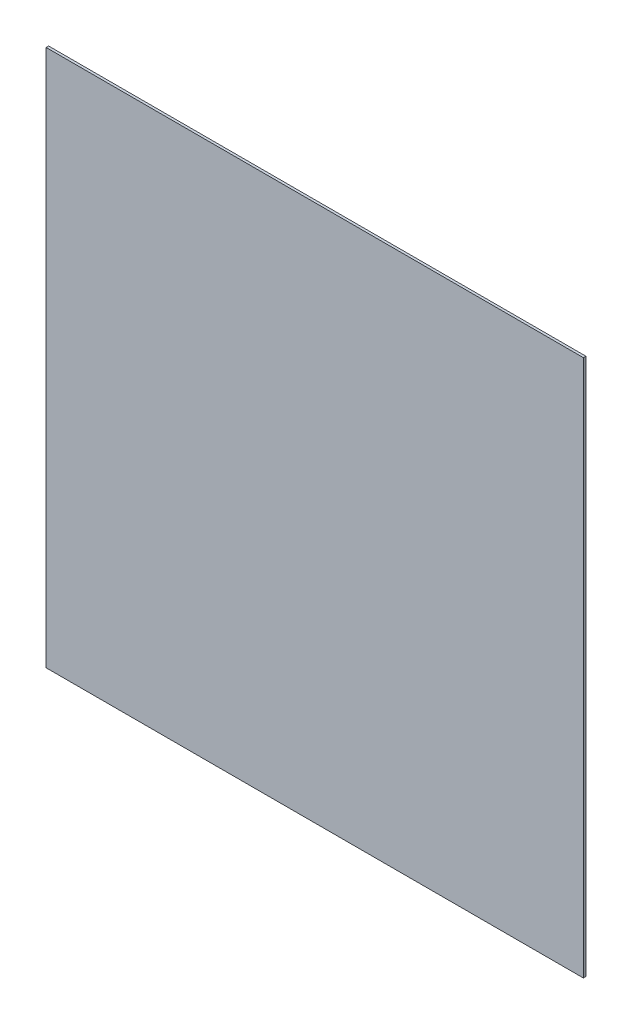
ISO-10303-21;
HEADER;
FILE_DESCRIPTION(('STEP AP214'),'2;1');
FILE_NAME('part.step','',(''),(''),'','','');
FILE_SCHEMA(('AUTOMOTIVE_DESIGN { 1 0 10303 214 1 1 1 1 }'));
ENDSEC;
DATA;
#1=APPLICATION_CONTEXT('core data for automotive mechanical design processes');
#2=APPLICATION_PROTOCOL_DEFINITION('international standard','automotive_design',2000,#1);
#3=PRODUCT_CONTEXT('',#1,'mechanical');
#4=PRODUCT('Part','Part','',(#3));
#5=PRODUCT_RELATED_PRODUCT_CATEGORY('part','',(#4));
#6=PRODUCT_DEFINITION_FORMATION('','',#4);
#7=PRODUCT_DEFINITION_CONTEXT('part definition',#1,'design');
#8=PRODUCT_DEFINITION('design','',#6,#7);
#9=PRODUCT_DEFINITION_SHAPE('','',#8);
#10=(LENGTH_UNIT() NAMED_UNIT(*) SI_UNIT(.MILLI.,.METRE.));
#11=(NAMED_UNIT(*) PLANE_ANGLE_UNIT() SI_UNIT($,.RADIAN.));
#12=(NAMED_UNIT(*) SI_UNIT($,.STERADIAN.) SOLID_ANGLE_UNIT());
#13=UNCERTAINTY_MEASURE_WITH_UNIT(LENGTH_MEASURE(1.E-05),#10,'distance_accuracy_value','');
#14=(GEOMETRIC_REPRESENTATION_CONTEXT(3) GLOBAL_UNCERTAINTY_ASSIGNED_CONTEXT((#13)) GLOBAL_UNIT_ASSIGNED_CONTEXT((#10,
#11,#12)) REPRESENTATION_CONTEXT('',''));
#15=CARTESIAN_POINT('',(0.,0.,0.));
#16=DIRECTION('',(0.,0.,1.));
#17=DIRECTION('',(1.,0.,0.));
#18=AXIS2_PLACEMENT_3D('',#15,#16,#17);
#19=CARTESIAN_POINT('',(-160.,160.,1.5));
#20=DIRECTION('',(1.,0.,0.));
#21=DIRECTION('',(0.,1.,0.));
#22=AXIS2_PLACEMENT_3D('',#19,#20,#21);
#23=PLANE('',#22);
#24=DIRECTION('',(0.,-1.,0.));
#25=VECTOR('',#24,1.);
#26=CARTESIAN_POINT('',(-160.,160.,0.));
#27=LINE('',#26,#25);
#28=CARTESIAN_POINT('',(-160.,160.,0.));
#29=VERTEX_POINT('',#28);
#30=CARTESIAN_POINT('',(-160.,-160.,0.));
#31=VERTEX_POINT('',#30);
#32=EDGE_CURVE('E96',#29,#31,#27,.T.);
#33=ORIENTED_EDGE('',*,*,#32,.T.);
#34=DIRECTION('',(0.,0.,-1.));
#35=VECTOR('',#34,1.);
#36=CARTESIAN_POINT('',(-160.,-160.,1.5));
#37=LINE('',#36,#35);
#38=CARTESIAN_POINT('',(-160.,-160.,1.5));
#39=VERTEX_POINT('',#38);
#40=EDGE_CURVE('E11',#39,#31,#37,.T.);
#41=ORIENTED_EDGE('',*,*,#40,.F.);
#42=DIRECTION('',(0.,-1.,0.));
#43=VECTOR('',#42,1.);
#44=CARTESIAN_POINT('',(-160.,160.,1.5));
#45=LINE('',#44,#43);
#46=CARTESIAN_POINT('',(-160.,160.,1.5));
#47=VERTEX_POINT('',#46);
#48=EDGE_CURVE('E84',#47,#39,#45,.T.);
#49=ORIENTED_EDGE('',*,*,#48,.F.);
#50=DIRECTION('',(0.,0.,-1.));
#51=VECTOR('',#50,1.);
#52=CARTESIAN_POINT('',(-160.,160.,1.5));
#53=LINE('',#52,#51);
#54=EDGE_CURVE('E92',#47,#29,#53,.T.);
#55=ORIENTED_EDGE('',*,*,#54,.T.);
#56=EDGE_LOOP('',(#33,#41,#49,#55));
#57=FACE_BOUND('',#56,.T.);
#58=ADVANCED_FACE('F33',(#57),#23,.F.);
#59=CARTESIAN_POINT('',(-160.,-160.,1.5));
#60=DIRECTION('',(0.,1.,0.));
#61=DIRECTION('',(0.,0.,1.));
#62=AXIS2_PLACEMENT_3D('',#59,#60,#61);
#63=PLANE('',#62);
#64=DIRECTION('',(1.,0.,0.));
#65=VECTOR('',#64,1.);
#66=CARTESIAN_POINT('',(-160.,-160.,0.));
#67=LINE('',#66,#65);
#68=CARTESIAN_POINT('',(160.,-160.,0.));
#69=VERTEX_POINT('',#68);
#70=EDGE_CURVE('E88',#31,#69,#67,.T.);
#71=ORIENTED_EDGE('',*,*,#70,.T.);
#72=DIRECTION('',(0.,0.,-1.));
#73=VECTOR('',#72,1.);
#74=CARTESIAN_POINT('',(160.,-160.,1.5));
#75=LINE('',#74,#73);
#76=CARTESIAN_POINT('',(160.,-160.,1.5));
#77=VERTEX_POINT('',#76);
#78=EDGE_CURVE('E41',#77,#69,#75,.T.);
#79=ORIENTED_EDGE('',*,*,#78,.F.);
#80=DIRECTION('',(1.,0.,0.));
#81=VECTOR('',#80,1.);
#82=CARTESIAN_POINT('',(-160.,-160.,1.5));
#83=LINE('',#82,#81);
#84=EDGE_CURVE('E79',#39,#77,#83,.T.);
#85=ORIENTED_EDGE('',*,*,#84,.F.);
#86=ORIENTED_EDGE('',*,*,#40,.T.);
#87=EDGE_LOOP('',(#71,#79,#85,#86));
#88=FACE_BOUND('',#87,.T.);
#89=ADVANCED_FACE('F87',(#88),#63,.F.);
#90=CARTESIAN_POINT('',(160.,160.,1.5));
#91=DIRECTION('',(-1.,0.,0.));
#92=DIRECTION('',(0.,-1.,0.));
#93=AXIS2_PLACEMENT_3D('',#90,#91,#92);
#94=PLANE('',#93);
#95=DIRECTION('',(0.,1.,0.));
#96=VECTOR('',#95,1.);
#97=CARTESIAN_POINT('',(160.,160.,0.));
#98=LINE('',#97,#96);
#99=CARTESIAN_POINT('',(160.,160.,0.));
#100=VERTEX_POINT('',#99);
#101=EDGE_CURVE('E66',#69,#100,#98,.T.);
#102=ORIENTED_EDGE('',*,*,#101,.T.);
#103=DIRECTION('',(0.,0.,-1.));
#104=VECTOR('',#103,1.);
#105=CARTESIAN_POINT('',(160.,160.,1.5));
#106=LINE('',#105,#104);
#107=CARTESIAN_POINT('',(160.,160.,1.5));
#108=VERTEX_POINT('',#107);
#109=EDGE_CURVE('E89',#108,#100,#106,.T.);
#110=ORIENTED_EDGE('',*,*,#109,.F.);
#111=DIRECTION('',(0.,1.,0.));
#112=VECTOR('',#111,1.);
#113=CARTESIAN_POINT('',(160.,160.,1.5));
#114=LINE('',#113,#112);
#115=EDGE_CURVE('E82',#77,#108,#114,.T.);
#116=ORIENTED_EDGE('',*,*,#115,.F.);
#117=ORIENTED_EDGE('',*,*,#78,.T.);
#118=EDGE_LOOP('',(#102,#110,#116,#117));
#119=FACE_BOUND('',#118,.T.);
#120=ADVANCED_FACE('F90',(#119),#94,.F.);
#121=CARTESIAN_POINT('',(-160.,160.,1.5));
#122=DIRECTION('',(0.,-1.,0.));
#123=DIRECTION('',(0.,0.,-1.));
#124=AXIS2_PLACEMENT_3D('',#121,#122,#123);
#125=PLANE('',#124);
#126=DIRECTION('',(-1.,0.,0.));
#127=VECTOR('',#126,1.);
#128=CARTESIAN_POINT('',(-160.,160.,0.));
#129=LINE('',#128,#127);
#130=EDGE_CURVE('E72',#100,#29,#129,.T.);
#131=ORIENTED_EDGE('',*,*,#130,.T.);
#132=ORIENTED_EDGE('',*,*,#54,.F.);
#133=DIRECTION('',(-1.,0.,0.));
#134=VECTOR('',#133,1.);
#135=CARTESIAN_POINT('',(-160.,160.,1.5));
#136=LINE('',#135,#134);
#137=EDGE_CURVE('E49',#108,#47,#136,.T.);
#138=ORIENTED_EDGE('',*,*,#137,.F.);
#139=ORIENTED_EDGE('',*,*,#109,.T.);
#140=EDGE_LOOP('',(#131,#132,#138,#139));
#141=FACE_BOUND('',#140,.T.);
#142=ADVANCED_FACE('F103',(#141),#125,.F.);
#143=CARTESIAN_POINT('',(0.,0.,1.5));
#144=DIRECTION('',(0.,0.,1.));
#145=DIRECTION('',(1.,0.,0.));
#146=AXIS2_PLACEMENT_3D('',#143,#144,#145);
#147=PLANE('',#146);
#148=ORIENTED_EDGE('',*,*,#48,.T.);
#149=ORIENTED_EDGE('',*,*,#84,.T.);
#150=ORIENTED_EDGE('',*,*,#115,.T.);
#151=ORIENTED_EDGE('',*,*,#137,.T.);
#152=EDGE_LOOP('',(#148,#149,#150,#151));
#153=FACE_BOUND('',#152,.T.);
#154=ADVANCED_FACE('F80',(#153),#147,.T.);
#155=CARTESIAN_POINT('',(0.,0.,0.));
#156=DIRECTION('',(0.,0.,1.));
#157=DIRECTION('',(1.,0.,0.));
#158=AXIS2_PLACEMENT_3D('',#155,#156,#157);
#159=PLANE('',#158);
#160=ORIENTED_EDGE('',*,*,#32,.F.);
#161=ORIENTED_EDGE('',*,*,#130,.F.);
#162=ORIENTED_EDGE('',*,*,#101,.F.);
#163=ORIENTED_EDGE('',*,*,#70,.F.);
#164=EDGE_LOOP('',(#160,#161,#162,#163));
#165=FACE_BOUND('',#164,.T.);
#166=ADVANCED_FACE('F106',(#165),#159,.F.);
#167=CLOSED_SHELL('',(#58,#89,#120,#142,#154,#166));
#168=MANIFOLD_SOLID_BREP('B2',#167);
#169=ADVANCED_BREP_SHAPE_REPRESENTATION('',(#18,#168),#14);
#170=SHAPE_DEFINITION_REPRESENTATION(#9,#169);
ENDSEC;
END-ISO-10303-21;
